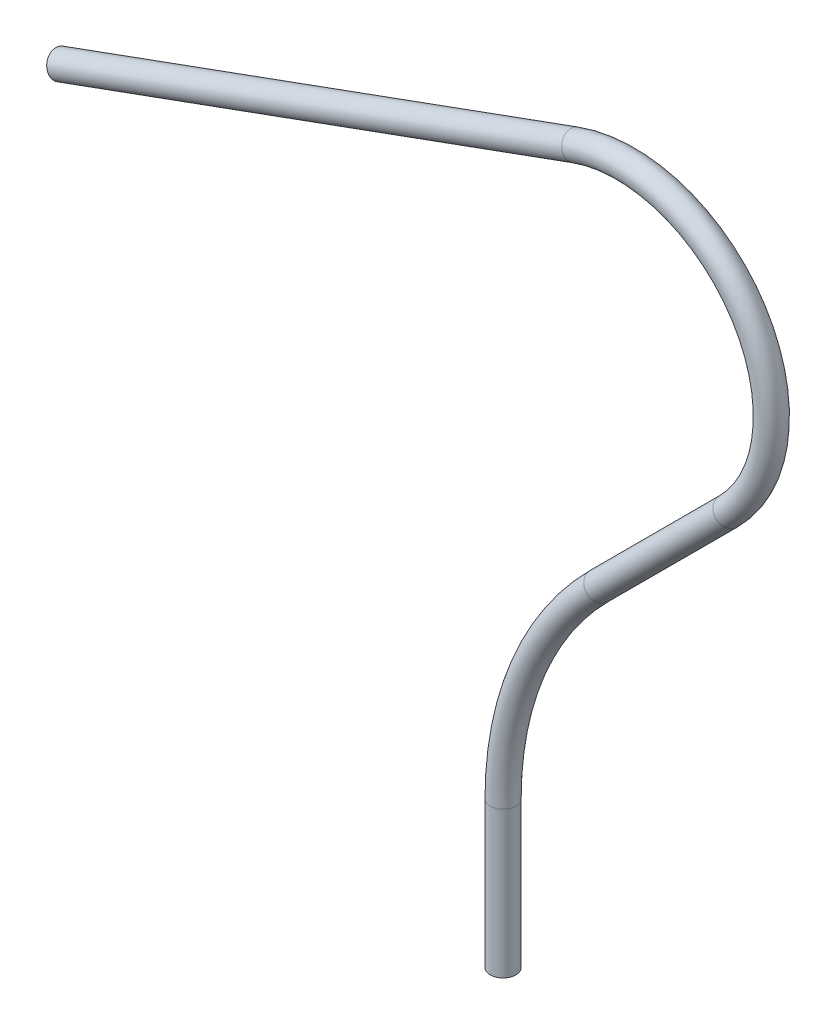
ISO-10303-21;
HEADER;
FILE_DESCRIPTION(('STEP AP214'),'2;1');
FILE_NAME('part.step','',(''),(''),'','','');
FILE_SCHEMA(('AUTOMOTIVE_DESIGN { 1 0 10303 214 1 1 1 1 }'));
ENDSEC;
DATA;
#1=APPLICATION_CONTEXT('core data for automotive mechanical design processes');
#2=APPLICATION_PROTOCOL_DEFINITION('international standard','automotive_design',2000,#1);
#3=PRODUCT_CONTEXT('',#1,'mechanical');
#4=PRODUCT('Part','Part','',(#3));
#5=PRODUCT_RELATED_PRODUCT_CATEGORY('part','',(#4));
#6=PRODUCT_DEFINITION_FORMATION('','',#4);
#7=PRODUCT_DEFINITION_CONTEXT('part definition',#1,'design');
#8=PRODUCT_DEFINITION('design','',#6,#7);
#9=PRODUCT_DEFINITION_SHAPE('','',#8);
#10=(LENGTH_UNIT() NAMED_UNIT(*) SI_UNIT(.MILLI.,.METRE.));
#11=(NAMED_UNIT(*) PLANE_ANGLE_UNIT() SI_UNIT($,.RADIAN.));
#12=(NAMED_UNIT(*) SI_UNIT($,.STERADIAN.) SOLID_ANGLE_UNIT());
#13=UNCERTAINTY_MEASURE_WITH_UNIT(LENGTH_MEASURE(1.E-05),#10,'distance_accuracy_value','');
#14=(GEOMETRIC_REPRESENTATION_CONTEXT(3) GLOBAL_UNCERTAINTY_ASSIGNED_CONTEXT((#13)) GLOBAL_UNIT_ASSIGNED_CONTEXT((#10,
#11,#12)) REPRESENTATION_CONTEXT('',''));
#15=CARTESIAN_POINT('',(0.,0.,0.));
#16=DIRECTION('',(0.,0.,1.));
#17=DIRECTION('',(1.,0.,0.));
#18=AXIS2_PLACEMENT_3D('',#15,#16,#17);
#19=CARTESIAN_POINT('',(0.,0.,0.));
#20=DIRECTION('',(0.,1.,0.));
#21=DIRECTION('',(0.,0.,1.));
#22=AXIS2_PLACEMENT_3D('',#19,#20,#21);
#23=PLANE('',#22);
#24=CARTESIAN_POINT('',(0.,0.,0.));
#25=DIRECTION('',(0.,1.,0.));
#26=DIRECTION('',(0.,0.,1.));
#27=AXIS2_PLACEMENT_3D('',#24,#25,#26);
#28=CIRCLE('',#27,3.5);
#29=CARTESIAN_POINT('',(0.,0.,3.5));
#30=VERTEX_POINT('',#29);
#31=EDGE_CURVE('E53',#30,#30,#28,.T.);
#32=ORIENTED_EDGE('',*,*,#31,.F.);
#33=EDGE_LOOP('',(#32));
#34=FACE_BOUND('',#33,.T.);
#35=ADVANCED_FACE('F31',(#34),#23,.F.);
#36=CARTESIAN_POINT('',(-121.203241345837,153.563903946165,0.));
#37=DIRECTION('',(-0.939692620785909,-0.342020143325668,0.));
#38=DIRECTION('',(0.,0.,1.));
#39=AXIS2_PLACEMENT_3D('',#36,#37,#38);
#40=PLANE('',#39);
#41=CARTESIAN_POINT('',(-121.203241345837,153.563903946165,0.));
#42=DIRECTION('',(-0.939692620785909,-0.342020143325668,0.));
#43=DIRECTION('',(0.,0.,1.));
#44=AXIS2_PLACEMENT_3D('',#41,#42,#43);
#45=CIRCLE('',#44,3.5);
#46=CARTESIAN_POINT('',(-121.203241345837,153.563903946165,3.5));
#47=VERTEX_POINT('',#46);
#48=EDGE_CURVE('E10',#47,#47,#45,.T.);
#49=ORIENTED_EDGE('',*,*,#48,.T.);
#50=EDGE_LOOP('',(#49));
#51=FACE_BOUND('',#50,.T.);
#52=ADVANCED_FACE('F60',(#51),#40,.T.);
#53=CARTESIAN_POINT('',(0.,0.,0.));
#54=DIRECTION('',(0.,1.,0.));
#55=DIRECTION('',(-1.,0.,0.));
#56=AXIS2_PLACEMENT_3D('',#53,#54,#55);
#57=CYLINDRICAL_SURFACE('',#56,3.5);
#58=CARTESIAN_POINT('',(0.,40.,0.));
#59=DIRECTION('',(0.,1.,0.));
#60=DIRECTION('',(0.,0.,1.));
#61=AXIS2_PLACEMENT_3D('',#58,#59,#60);
#62=CIRCLE('',#61,3.5);
#63=CARTESIAN_POINT('',(-3.49999999999999,40.,0.));
#64=VERTEX_POINT('',#63);
#65=EDGE_CURVE('E50',#64,#64,#62,.T.);
#66=ORIENTED_EDGE('',*,*,#65,.F.);
#67=EDGE_LOOP('',(#66));
#68=FACE_BOUND('',#67,.T.);
#69=ORIENTED_EDGE('',*,*,#31,.T.);
#70=EDGE_LOOP('',(#69));
#71=FACE_BOUND('',#70,.T.);
#72=ADVANCED_FACE('F57',(#68,#71),#57,.T.);
#73=CARTESIAN_POINT('',(90.,40.,0.));
#74=DIRECTION('',(0.,0.,-1.));
#75=DIRECTION('',(-1.,0.,0.));
#76=AXIS2_PLACEMENT_3D('',#73,#74,#75);
#77=TOROIDAL_SURFACE('',#76,90.,3.5);
#78=CARTESIAN_POINT('',(26.3603896932107,103.639610306789,0.));
#79=DIRECTION('',(0.707106781186547,0.707106781186548,0.));
#80=DIRECTION('',(0.,0.,1.));
#81=AXIS2_PLACEMENT_3D('',#78,#79,#80);
#82=CIRCLE('',#81,3.5);
#83=CARTESIAN_POINT('',(23.8855159590578,106.114484040942,0.));
#84=VERTEX_POINT('',#83);
#85=EDGE_CURVE('E45',#84,#84,#82,.T.);
#86=CARTESIAN_POINT('',(90.,40.,0.));
#87=DIRECTION('',(0.,0.,-1.));
#88=DIRECTION('',(-1.,0.,0.));
#89=AXIS2_PLACEMENT_3D('',#86,#87,#88);
#90=CIRCLE('',#89,93.5);
#91=EDGE_CURVE('',#64,#84,#90,.T.);
#92=ORIENTED_EDGE('',*,*,#65,.T.);
#93=ORIENTED_EDGE('',*,*,#85,.F.);
#94=ORIENTED_EDGE('',*,*,#91,.T.);
#95=ORIENTED_EDGE('',*,*,#91,.F.);
#96=EDGE_LOOP('',(#92,#94,#93,#95));
#97=FACE_BOUND('',#96,.T.);
#98=ADVANCED_FACE('F78',(#97),#77,.T.);
#99=CARTESIAN_POINT('',(26.3603896932107,103.639610306789,0.));
#100=DIRECTION('',(0.707106781186547,0.707106781186548,0.));
#101=DIRECTION('',(-0.707106781186548,0.707106781186547,0.));
#102=AXIS2_PLACEMENT_3D('',#99,#100,#101);
#103=CYLINDRICAL_SURFACE('',#102,3.5);
#104=CARTESIAN_POINT('',(61.7157287525381,138.994949366117,0.));
#105=DIRECTION('',(0.707106781186547,0.707106781186548,0.));
#106=DIRECTION('',(0.,0.,1.));
#107=AXIS2_PLACEMENT_3D('',#104,#105,#106);
#108=CIRCLE('',#107,3.5);
#109=CARTESIAN_POINT('',(64.190602486691,136.520075631964,0.));
#110=VERTEX_POINT('',#109);
#111=EDGE_CURVE('E41',#110,#110,#108,.T.);
#112=ORIENTED_EDGE('',*,*,#111,.F.);
#113=EDGE_LOOP('',(#112));
#114=FACE_BOUND('',#113,.T.);
#115=ORIENTED_EDGE('',*,*,#85,.T.);
#116=EDGE_LOOP('',(#115));
#117=FACE_BOUND('',#116,.T.);
#118=ADVANCED_FACE('F72',(#114,#117),#103,.T.);
#119=CARTESIAN_POINT('',(33.4314575050762,167.279220613579,0.));
#120=DIRECTION('',(0.,0.,1.));
#121=DIRECTION('',(1.,0.,0.));
#122=AXIS2_PLACEMENT_3D('',#119,#120,#121);
#123=TOROIDAL_SURFACE('',#122,40.,3.5);
#124=CARTESIAN_POINT('',(19.7506517720495,204.866925445015,0.));
#125=DIRECTION('',(-0.939692620785909,-0.342020143325667,0.));
#126=DIRECTION('',(0.,0.,1.));
#127=AXIS2_PLACEMENT_3D('',#124,#125,#126);
#128=CIRCLE('',#127,3.5);
#129=CARTESIAN_POINT('',(18.5535812704097,208.155849617766,0.));
#130=VERTEX_POINT('',#129);
#131=EDGE_CURVE('E37',#130,#130,#128,.T.);
#132=CARTESIAN_POINT('',(33.4314575050762,167.279220613579,0.));
#133=DIRECTION('',(0.,0.,1.));
#134=DIRECTION('',(1.,0.,0.));
#135=AXIS2_PLACEMENT_3D('',#132,#133,#134);
#136=CIRCLE('',#135,43.5);
#137=EDGE_CURVE('',#110,#130,#136,.T.);
#138=ORIENTED_EDGE('',*,*,#111,.T.);
#139=ORIENTED_EDGE('',*,*,#131,.F.);
#140=ORIENTED_EDGE('',*,*,#137,.T.);
#141=ORIENTED_EDGE('',*,*,#137,.F.);
#142=EDGE_LOOP('',(#138,#140,#139,#141));
#143=FACE_BOUND('',#142,.T.);
#144=ADVANCED_FACE('F66',(#143),#123,.T.);
#145=CARTESIAN_POINT('',(19.7506517720495,204.866925445015,0.));
#146=DIRECTION('',(-0.939692620785909,-0.342020143325668,0.));
#147=DIRECTION('',(0.342020143325668,-0.939692620785909,0.));
#148=AXIS2_PLACEMENT_3D('',#145,#146,#147);
#149=CYLINDRICAL_SURFACE('',#148,3.5);
#150=ORIENTED_EDGE('',*,*,#48,.F.);
#151=EDGE_LOOP('',(#150));
#152=FACE_BOUND('',#151,.T.);
#153=ORIENTED_EDGE('',*,*,#131,.T.);
#154=EDGE_LOOP('',(#153));
#155=FACE_BOUND('',#154,.T.);
#156=ADVANCED_FACE('F64',(#152,#155),#149,.T.);
#157=CLOSED_SHELL('',(#35,#52,#72,#98,#118,#144,#156));
#158=MANIFOLD_SOLID_BREP('B2',#157);
#159=ADVANCED_BREP_SHAPE_REPRESENTATION('',(#18,#158),#14);
#160=SHAPE_DEFINITION_REPRESENTATION(#9,#159);
ENDSEC;
END-ISO-10303-21;
